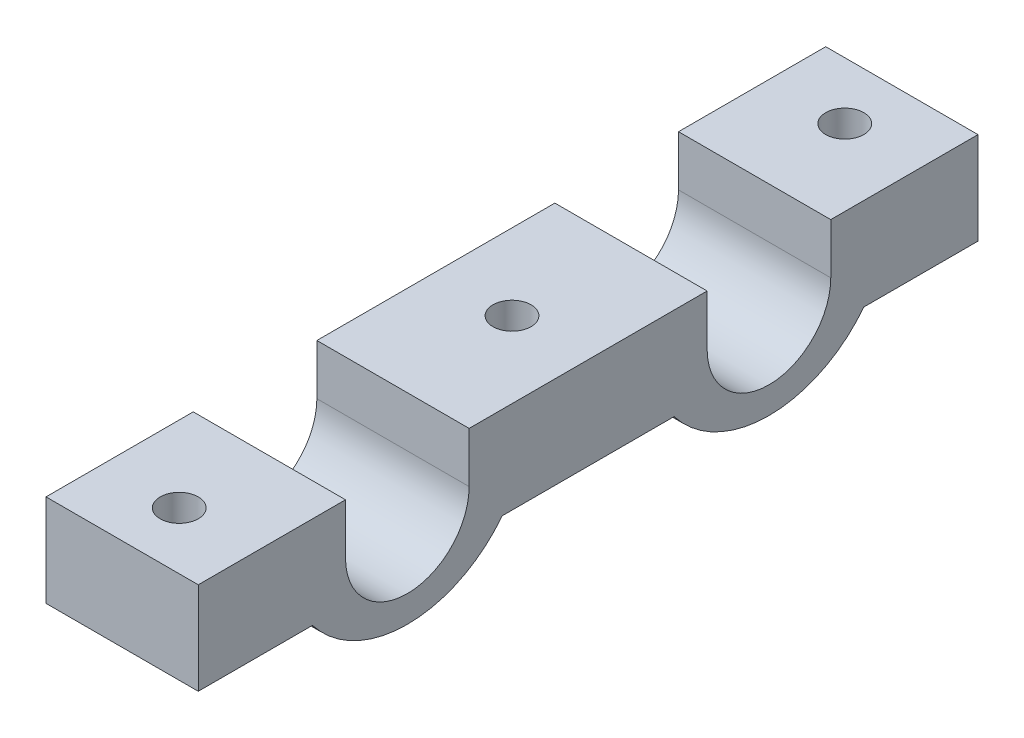
ISO-10303-21;
HEADER;
FILE_DESCRIPTION(('STEP AP214'),'2;1');
FILE_NAME('part.step','',(''),(''),'','','');
FILE_SCHEMA(('AUTOMOTIVE_DESIGN { 1 0 10303 214 1 1 1 1 }'));
ENDSEC;
DATA;
#1=APPLICATION_CONTEXT('core data for automotive mechanical design processes');
#2=APPLICATION_PROTOCOL_DEFINITION('international standard','automotive_design',2000,#1);
#3=PRODUCT_CONTEXT('',#1,'mechanical');
#4=PRODUCT('Part','Part','',(#3));
#5=PRODUCT_RELATED_PRODUCT_CATEGORY('part','',(#4));
#6=PRODUCT_DEFINITION_FORMATION('','',#4);
#7=PRODUCT_DEFINITION_CONTEXT('part definition',#1,'design');
#8=PRODUCT_DEFINITION('design','',#6,#7);
#9=PRODUCT_DEFINITION_SHAPE('','',#8);
#10=(LENGTH_UNIT() NAMED_UNIT(*) SI_UNIT(.MILLI.,.METRE.));
#11=(NAMED_UNIT(*) PLANE_ANGLE_UNIT() SI_UNIT($,.RADIAN.));
#12=(NAMED_UNIT(*) SI_UNIT($,.STERADIAN.) SOLID_ANGLE_UNIT());
#13=UNCERTAINTY_MEASURE_WITH_UNIT(LENGTH_MEASURE(1.E-05),#10,'distance_accuracy_value','');
#14=(GEOMETRIC_REPRESENTATION_CONTEXT(3) GLOBAL_UNCERTAINTY_ASSIGNED_CONTEXT((#13)) GLOBAL_UNIT_ASSIGNED_CONTEXT((#10,
#11,#12)) REPRESENTATION_CONTEXT('',''));
#15=CARTESIAN_POINT('',(0.,0.,0.));
#16=DIRECTION('',(0.,0.,1.));
#17=DIRECTION('',(1.,0.,0.));
#18=AXIS2_PLACEMENT_3D('',#15,#16,#17);
#19=CARTESIAN_POINT('',(40.,0.,0.));
#20=DIRECTION('',(-1.,0.,0.));
#21=DIRECTION('',(0.,0.,1.));
#22=AXIS2_PLACEMENT_3D('',#19,#20,#21);
#23=CYLINDRICAL_SURFACE('',#22,16.24);
#24=CARTESIAN_POINT('',(0.,0.,0.));
#25=DIRECTION('',(-1.,0.,0.));
#26=DIRECTION('',(0.,0.,-1.));
#27=AXIS2_PLACEMENT_3D('',#24,#25,#26);
#28=CIRCLE('',#27,16.24);
#29=CARTESIAN_POINT('',(0.,0.,-16.24));
#30=VERTEX_POINT('',#29);
#31=CARTESIAN_POINT('',(0.,0.,16.24));
#32=VERTEX_POINT('',#31);
#33=EDGE_CURVE('E194',#30,#32,#28,.T.);
#34=ORIENTED_EDGE('',*,*,#33,.T.);
#35=DIRECTION('',(-1.,0.,0.));
#36=VECTOR('',#35,1.);
#37=CARTESIAN_POINT('',(40.,0.,16.24));
#38=LINE('',#37,#36);
#39=CARTESIAN_POINT('',(40.,0.,16.24));
#40=VERTEX_POINT('',#39);
#41=EDGE_CURVE('E11',#40,#32,#38,.T.);
#42=ORIENTED_EDGE('',*,*,#41,.F.);
#43=CARTESIAN_POINT('',(40.,0.,0.));
#44=DIRECTION('',(-1.,0.,0.));
#45=DIRECTION('',(0.,0.,-1.));
#46=AXIS2_PLACEMENT_3D('',#43,#44,#45);
#47=CIRCLE('',#46,16.24);
#48=CARTESIAN_POINT('',(40.,0.,-16.24));
#49=VERTEX_POINT('',#48);
#50=EDGE_CURVE('E243',#49,#40,#47,.T.);
#51=ORIENTED_EDGE('',*,*,#50,.F.);
#52=DIRECTION('',(-1.,0.,0.));
#53=VECTOR('',#52,1.);
#54=CARTESIAN_POINT('',(40.,0.,-16.24));
#55=LINE('',#54,#53);
#56=EDGE_CURVE('E190',#49,#30,#55,.T.);
#57=ORIENTED_EDGE('',*,*,#56,.T.);
#58=EDGE_LOOP('',(#34,#42,#51,#57));
#59=FACE_BOUND('',#58,.T.);
#60=ADVANCED_FACE('F45',(#59),#23,.F.);
#61=CARTESIAN_POINT('',(40.,13.24,16.24));
#62=DIRECTION('',(0.,0.,1.));
#63=DIRECTION('',(1.,0.,0.));
#64=AXIS2_PLACEMENT_3D('',#61,#62,#63);
#65=PLANE('',#64);
#66=DIRECTION('',(0.,1.,0.));
#67=VECTOR('',#66,1.);
#68=CARTESIAN_POINT('',(0.,13.24,16.24));
#69=LINE('',#68,#67);
#70=CARTESIAN_POINT('',(0.,13.24,16.24));
#71=VERTEX_POINT('',#70);
#72=EDGE_CURVE('E198',#32,#71,#69,.T.);
#73=ORIENTED_EDGE('',*,*,#72,.T.);
#74=DIRECTION('',(-1.,0.,0.));
#75=VECTOR('',#74,1.);
#76=CARTESIAN_POINT('',(40.,13.24,16.24));
#77=LINE('',#76,#75);
#78=CARTESIAN_POINT('',(40.,13.24,16.24));
#79=VERTEX_POINT('',#78);
#80=EDGE_CURVE('E54',#79,#71,#77,.T.);
#81=ORIENTED_EDGE('',*,*,#80,.F.);
#82=DIRECTION('',(0.,1.,0.));
#83=VECTOR('',#82,1.);
#84=CARTESIAN_POINT('',(40.,13.24,16.24));
#85=LINE('',#84,#83);
#86=EDGE_CURVE('E129',#40,#79,#85,.T.);
#87=ORIENTED_EDGE('',*,*,#86,.F.);
#88=ORIENTED_EDGE('',*,*,#41,.T.);
#89=EDGE_LOOP('',(#73,#81,#87,#88));
#90=FACE_BOUND('',#89,.T.);
#91=ADVANCED_FACE('F365',(#90),#65,.F.);
#92=CARTESIAN_POINT('',(40.,13.24,54.9202247180879));
#93=DIRECTION('',(0.,-1.,0.));
#94=DIRECTION('',(0.,0.,-1.));
#95=AXIS2_PLACEMENT_3D('',#92,#93,#94);
#96=PLANE('',#95);
#97=CARTESIAN_POINT('',(20.,13.24,39.9202247180879));
#98=DIRECTION('',(0.,1.,0.));
#99=DIRECTION('',(0.,0.,1.));
#100=AXIS2_PLACEMENT_3D('',#97,#98,#99);
#101=CIRCLE('',#100,5.);
#102=CARTESIAN_POINT('',(20.,13.24,44.9202247180879));
#103=VERTEX_POINT('',#102);
#104=EDGE_CURVE('E635',#103,#103,#101,.T.);
#105=ORIENTED_EDGE('',*,*,#104,.F.);
#106=EDGE_LOOP('',(#105));
#107=FACE_BOUND('',#106,.T.);
#108=DIRECTION('',(0.,0.,1.));
#109=VECTOR('',#108,1.);
#110=CARTESIAN_POINT('',(0.,13.24,54.9202247180879));
#111=LINE('',#110,#109);
#112=CARTESIAN_POINT('',(0.,13.24,54.9202247180879));
#113=VERTEX_POINT('',#112);
#114=EDGE_CURVE('E202',#71,#113,#111,.T.);
#115=ORIENTED_EDGE('',*,*,#114,.T.);
#116=DIRECTION('',(-1.,0.,0.));
#117=VECTOR('',#116,1.);
#118=CARTESIAN_POINT('',(40.,13.24,54.9202247180879));
#119=LINE('',#118,#117);
#120=CARTESIAN_POINT('',(40.,13.24,54.9202247180879));
#121=VERTEX_POINT('',#120);
#122=EDGE_CURVE('E286',#121,#113,#119,.T.);
#123=ORIENTED_EDGE('',*,*,#122,.F.);
#124=DIRECTION('',(0.,0.,1.));
#125=VECTOR('',#124,1.);
#126=CARTESIAN_POINT('',(40.,13.24,54.9202247180879));
#127=LINE('',#126,#125);
#128=EDGE_CURVE('E296',#79,#121,#127,.T.);
#129=ORIENTED_EDGE('',*,*,#128,.F.);
#130=ORIENTED_EDGE('',*,*,#80,.T.);
#131=EDGE_LOOP('',(#115,#123,#129,#130));
#132=FACE_BOUND('',#131,.T.);
#133=ADVANCED_FACE('F294',(#107,#132),#96,.F.);
#134=CARTESIAN_POINT('',(40.,0.,54.9202247180879));
#135=DIRECTION('',(0.,0.,-1.));
#136=DIRECTION('',(-1.,0.,0.));
#137=AXIS2_PLACEMENT_3D('',#134,#135,#136);
#138=PLANE('',#137);
#139=DIRECTION('',(0.,-1.,0.));
#140=VECTOR('',#139,1.);
#141=CARTESIAN_POINT('',(0.,0.,54.9202247180879));
#142=LINE('',#141,#140);
#143=CARTESIAN_POINT('',(0.,-11.,54.9202247180879));
#144=VERTEX_POINT('',#143);
#145=EDGE_CURVE('E206',#113,#144,#142,.T.);
#146=ORIENTED_EDGE('',*,*,#145,.T.);
#147=DIRECTION('',(-1.,0.,0.));
#148=VECTOR('',#147,1.);
#149=CARTESIAN_POINT('',(40.,-11.,54.9202247180879));
#150=LINE('',#149,#148);
#151=CARTESIAN_POINT('',(40.,-11.,54.9202247180879));
#152=VERTEX_POINT('',#151);
#153=EDGE_CURVE('E282',#152,#144,#150,.T.);
#154=ORIENTED_EDGE('',*,*,#153,.F.);
#155=DIRECTION('',(0.,-1.,0.));
#156=VECTOR('',#155,1.);
#157=CARTESIAN_POINT('',(40.,0.,54.9202247180879));
#158=LINE('',#157,#156);
#159=EDGE_CURVE('E314',#121,#152,#158,.T.);
#160=ORIENTED_EDGE('',*,*,#159,.F.);
#161=ORIENTED_EDGE('',*,*,#122,.T.);
#162=EDGE_LOOP('',(#146,#154,#160,#161));
#163=FACE_BOUND('',#162,.T.);
#164=ADVANCED_FACE('F304',(#163),#138,.F.);
#165=CARTESIAN_POINT('',(40.,-11.,24.9202247180879));
#166=DIRECTION('',(0.,1.,0.));
#167=DIRECTION('',(0.,0.,1.));
#168=AXIS2_PLACEMENT_3D('',#165,#166,#167);
#169=PLANE('',#168);
#170=CARTESIAN_POINT('',(20.,-11.,39.9202247180879));
#171=DIRECTION('',(0.,1.,0.));
#172=DIRECTION('',(0.,0.,1.));
#173=AXIS2_PLACEMENT_3D('',#170,#171,#172);
#174=CIRCLE('',#173,5.);
#175=CARTESIAN_POINT('',(20.,-11.,44.9202247180879));
#176=VERTEX_POINT('',#175);
#177=EDGE_CURVE('E199',#176,#176,#174,.F.);
#178=ORIENTED_EDGE('',*,*,#177,.F.);
#179=EDGE_LOOP('',(#178));
#180=FACE_BOUND('',#179,.T.);
#181=DIRECTION('',(0.,0.,-1.));
#182=VECTOR('',#181,1.);
#183=CARTESIAN_POINT('',(0.,-11.,24.9202247180879));
#184=LINE('',#183,#182);
#185=CARTESIAN_POINT('',(0.,-11.,24.9202247180879));
#186=VERTEX_POINT('',#185);
#187=EDGE_CURVE('E209',#144,#186,#184,.T.);
#188=ORIENTED_EDGE('',*,*,#187,.T.);
#189=DIRECTION('',(-1.,0.,0.));
#190=VECTOR('',#189,1.);
#191=CARTESIAN_POINT('',(40.,-11.,24.9202247180879));
#192=LINE('',#191,#190);
#193=CARTESIAN_POINT('',(40.,-11.,24.9202247180879));
#194=VERTEX_POINT('',#193);
#195=EDGE_CURVE('E278',#194,#186,#192,.T.);
#196=ORIENTED_EDGE('',*,*,#195,.F.);
#197=DIRECTION('',(0.,0.,-1.));
#198=VECTOR('',#197,1.);
#199=CARTESIAN_POINT('',(40.,-11.,24.9202247180879));
#200=LINE('',#199,#198);
#201=EDGE_CURVE('E310',#152,#194,#200,.T.);
#202=ORIENTED_EDGE('',*,*,#201,.F.);
#203=ORIENTED_EDGE('',*,*,#153,.T.);
#204=EDGE_LOOP('',(#188,#196,#202,#203));
#205=FACE_BOUND('',#204,.T.);
#206=ADVANCED_FACE('F308',(#180,#205),#169,.F.);
#207=CARTESIAN_POINT('',(40.,8.2483660130719,0.));
#208=DIRECTION('',(-1.,0.,0.));
#209=DIRECTION('',(0.,0.,1.));
#210=AXIS2_PLACEMENT_3D('',#207,#208,#209);
#211=CYLINDRICAL_SURFACE('',#210,31.4883660130719);
#212=CARTESIAN_POINT('',(0.,8.2483660130719,0.));
#213=DIRECTION('',(1.,0.,0.));
#214=DIRECTION('',(0.,0.,-1.));
#215=AXIS2_PLACEMENT_3D('',#212,#213,#214);
#216=CIRCLE('',#215,31.4883660130719);
#217=CARTESIAN_POINT('',(0.,-11.,-24.9202247180879));
#218=VERTEX_POINT('',#217);
#219=EDGE_CURVE('E212',#186,#218,#216,.T.);
#220=ORIENTED_EDGE('',*,*,#219,.T.);
#221=DIRECTION('',(-1.,0.,0.));
#222=VECTOR('',#221,1.);
#223=CARTESIAN_POINT('',(40.,-11.,-24.9202247180879));
#224=LINE('',#223,#222);
#225=CARTESIAN_POINT('',(40.,-11.,-24.9202247180879));
#226=VERTEX_POINT('',#225);
#227=EDGE_CURVE('E274',#226,#218,#224,.T.);
#228=ORIENTED_EDGE('',*,*,#227,.F.);
#229=CARTESIAN_POINT('',(40.,8.2483660130719,0.));
#230=DIRECTION('',(1.,0.,0.));
#231=DIRECTION('',(0.,0.,-1.));
#232=AXIS2_PLACEMENT_3D('',#229,#230,#231);
#233=CIRCLE('',#232,31.4883660130719);
#234=EDGE_CURVE('E313',#194,#226,#233,.T.);
#235=ORIENTED_EDGE('',*,*,#234,.F.);
#236=ORIENTED_EDGE('',*,*,#195,.T.);
#237=EDGE_LOOP('',(#220,#228,#235,#236));
#238=FACE_BOUND('',#237,.T.);
#239=ADVANCED_FACE('F379',(#238),#211,.T.);
#240=CARTESIAN_POINT('',(40.,-11.,-24.9202247180879));
#241=DIRECTION('',(0.,1.,0.));
#242=DIRECTION('',(0.,0.,1.));
#243=AXIS2_PLACEMENT_3D('',#240,#241,#242);
#244=PLANE('',#243);
#245=CARTESIAN_POINT('',(20.,-11.,-47.5));
#246=DIRECTION('',(0.,1.,0.));
#247=DIRECTION('',(0.,0.,1.));
#248=AXIS2_PLACEMENT_3D('',#245,#246,#247);
#249=CIRCLE('',#248,5.);
#250=CARTESIAN_POINT('',(20.,-11.,-42.5));
#251=VERTEX_POINT('',#250);
#252=EDGE_CURVE('E644',#251,#251,#249,.F.);
#253=ORIENTED_EDGE('',*,*,#252,.F.);
#254=EDGE_LOOP('',(#253));
#255=FACE_BOUND('',#254,.T.);
#256=DIRECTION('',(0.,0.,-1.));
#257=VECTOR('',#256,1.);
#258=CARTESIAN_POINT('',(0.,-11.,-24.9202247180879));
#259=LINE('',#258,#257);
#260=CARTESIAN_POINT('',(0.,-11.,-70.0797752819121));
#261=VERTEX_POINT('',#260);
#262=EDGE_CURVE('E215',#218,#261,#259,.T.);
#263=ORIENTED_EDGE('',*,*,#262,.T.);
#264=DIRECTION('',(-1.,0.,0.));
#265=VECTOR('',#264,1.);
#266=CARTESIAN_POINT('',(40.,-11.,-70.0797752819121));
#267=LINE('',#266,#265);
#268=CARTESIAN_POINT('',(40.,-11.,-70.0797752819121));
#269=VERTEX_POINT('',#268);
#270=EDGE_CURVE('E270',#269,#261,#267,.T.);
#271=ORIENTED_EDGE('',*,*,#270,.F.);
#272=DIRECTION('',(0.,0.,-1.));
#273=VECTOR('',#272,1.);
#274=CARTESIAN_POINT('',(40.,-11.,-24.9202247180879));
#275=LINE('',#274,#273);
#276=EDGE_CURVE('E318',#226,#269,#275,.T.);
#277=ORIENTED_EDGE('',*,*,#276,.F.);
#278=ORIENTED_EDGE('',*,*,#227,.T.);
#279=EDGE_LOOP('',(#263,#271,#277,#278));
#280=FACE_BOUND('',#279,.T.);
#281=ADVANCED_FACE('F383',(#255,#280),#244,.F.);
#282=CARTESIAN_POINT('',(40.,8.2483660130719,-95.));
#283=DIRECTION('',(-1.,0.,0.));
#284=DIRECTION('',(0.,0.,1.));
#285=AXIS2_PLACEMENT_3D('',#282,#283,#284);
#286=CYLINDRICAL_SURFACE('',#285,31.4883660130719);
#287=CARTESIAN_POINT('',(0.,8.2483660130719,-95.));
#288=DIRECTION('',(1.,0.,0.));
#289=DIRECTION('',(0.,0.,-1.));
#290=AXIS2_PLACEMENT_3D('',#287,#288,#289);
#291=CIRCLE('',#290,31.4883660130719);
#292=CARTESIAN_POINT('',(0.,-11.,-119.920224718088));
#293=VERTEX_POINT('',#292);
#294=EDGE_CURVE('E218',#261,#293,#291,.T.);
#295=ORIENTED_EDGE('',*,*,#294,.T.);
#296=DIRECTION('',(-1.,0.,0.));
#297=VECTOR('',#296,1.);
#298=CARTESIAN_POINT('',(40.,-11.,-119.920224718088));
#299=LINE('',#298,#297);
#300=CARTESIAN_POINT('',(40.,-11.,-119.920224718088));
#301=VERTEX_POINT('',#300);
#302=EDGE_CURVE('E266',#301,#293,#299,.T.);
#303=ORIENTED_EDGE('',*,*,#302,.F.);
#304=CARTESIAN_POINT('',(40.,8.2483660130719,-95.));
#305=DIRECTION('',(1.,0.,0.));
#306=DIRECTION('',(0.,0.,-1.));
#307=AXIS2_PLACEMENT_3D('',#304,#305,#306);
#308=CIRCLE('',#307,31.4883660130719);
#309=EDGE_CURVE('E325',#269,#301,#308,.T.);
#310=ORIENTED_EDGE('',*,*,#309,.F.);
#311=ORIENTED_EDGE('',*,*,#270,.T.);
#312=EDGE_LOOP('',(#295,#303,#310,#311));
#313=FACE_BOUND('',#312,.T.);
#314=ADVANCED_FACE('F387',(#313),#286,.T.);
#315=CARTESIAN_POINT('',(40.,-11.,-119.920224718088));
#316=DIRECTION('',(0.,1.,0.));
#317=DIRECTION('',(0.,0.,1.));
#318=AXIS2_PLACEMENT_3D('',#315,#316,#317);
#319=PLANE('',#318);
#320=CARTESIAN_POINT('',(20.,-11.,-134.920224718088));
#321=DIRECTION('',(0.,1.,0.));
#322=DIRECTION('',(0.,0.,1.));
#323=AXIS2_PLACEMENT_3D('',#320,#321,#322);
#324=CIRCLE('',#323,5.);
#325=CARTESIAN_POINT('',(20.,-11.,-129.920224718088));
#326=VERTEX_POINT('',#325);
#327=EDGE_CURVE('E652',#326,#326,#324,.F.);
#328=ORIENTED_EDGE('',*,*,#327,.F.);
#329=EDGE_LOOP('',(#328));
#330=FACE_BOUND('',#329,.T.);
#331=DIRECTION('',(0.,0.,-1.));
#332=VECTOR('',#331,1.);
#333=CARTESIAN_POINT('',(0.,-11.,-119.920224718088));
#334=LINE('',#333,#332);
#335=CARTESIAN_POINT('',(0.,-11.,-149.920224718088));
#336=VERTEX_POINT('',#335);
#337=EDGE_CURVE('E221',#293,#336,#334,.T.);
#338=ORIENTED_EDGE('',*,*,#337,.T.);
#339=DIRECTION('',(-1.,0.,0.));
#340=VECTOR('',#339,1.);
#341=CARTESIAN_POINT('',(40.,-11.,-149.920224718088));
#342=LINE('',#341,#340);
#343=CARTESIAN_POINT('',(40.,-11.,-149.920224718088));
#344=VERTEX_POINT('',#343);
#345=EDGE_CURVE('E262',#344,#336,#342,.T.);
#346=ORIENTED_EDGE('',*,*,#345,.F.);
#347=DIRECTION('',(0.,0.,-1.));
#348=VECTOR('',#347,1.);
#349=CARTESIAN_POINT('',(40.,-11.,-119.920224718088));
#350=LINE('',#349,#348);
#351=EDGE_CURVE('E328',#301,#344,#350,.T.);
#352=ORIENTED_EDGE('',*,*,#351,.F.);
#353=ORIENTED_EDGE('',*,*,#302,.T.);
#354=EDGE_LOOP('',(#338,#346,#352,#353));
#355=FACE_BOUND('',#354,.T.);
#356=ADVANCED_FACE('F391',(#330,#355),#319,.F.);
#357=CARTESIAN_POINT('',(40.,13.24,-149.920224718088));
#358=DIRECTION('',(0.,0.,1.));
#359=DIRECTION('',(1.,0.,0.));
#360=AXIS2_PLACEMENT_3D('',#357,#358,#359);
#361=PLANE('',#360);
#362=DIRECTION('',(0.,1.,0.));
#363=VECTOR('',#362,1.);
#364=CARTESIAN_POINT('',(0.,13.24,-149.920224718088));
#365=LINE('',#364,#363);
#366=CARTESIAN_POINT('',(0.,13.24,-149.920224718088));
#367=VERTEX_POINT('',#366);
#368=EDGE_CURVE('E225',#336,#367,#365,.T.);
#369=ORIENTED_EDGE('',*,*,#368,.T.);
#370=DIRECTION('',(-1.,0.,0.));
#371=VECTOR('',#370,1.);
#372=CARTESIAN_POINT('',(40.,13.24,-149.920224718088));
#373=LINE('',#372,#371);
#374=CARTESIAN_POINT('',(40.,13.24,-149.920224718088));
#375=VERTEX_POINT('',#374);
#376=EDGE_CURVE('E258',#375,#367,#373,.T.);
#377=ORIENTED_EDGE('',*,*,#376,.F.);
#378=DIRECTION('',(0.,1.,0.));
#379=VECTOR('',#378,1.);
#380=CARTESIAN_POINT('',(40.,0.,-149.920224718088));
#381=LINE('',#380,#379);
#382=EDGE_CURVE('E331',#344,#375,#381,.T.);
#383=ORIENTED_EDGE('',*,*,#382,.F.);
#384=ORIENTED_EDGE('',*,*,#345,.T.);
#385=EDGE_LOOP('',(#369,#377,#383,#384));
#386=FACE_BOUND('',#385,.T.);
#387=ADVANCED_FACE('F395',(#386),#361,.F.);
#388=CARTESIAN_POINT('',(40.,13.24,-111.24));
#389=DIRECTION('',(0.,-1.,0.));
#390=DIRECTION('',(0.,0.,-1.));
#391=AXIS2_PLACEMENT_3D('',#388,#389,#390);
#392=PLANE('',#391);
#393=CARTESIAN_POINT('',(20.,13.24,-134.920224718088));
#394=DIRECTION('',(0.,1.,0.));
#395=DIRECTION('',(0.,0.,-1.));
#396=AXIS2_PLACEMENT_3D('',#393,#394,#395);
#397=CIRCLE('',#396,5.);
#398=CARTESIAN_POINT('',(20.,13.24,-139.920224718088));
#399=VERTEX_POINT('',#398);
#400=EDGE_CURVE('E648',#399,#399,#397,.T.);
#401=ORIENTED_EDGE('',*,*,#400,.F.);
#402=EDGE_LOOP('',(#401));
#403=FACE_BOUND('',#402,.T.);
#404=DIRECTION('',(0.,0.,1.));
#405=VECTOR('',#404,1.);
#406=CARTESIAN_POINT('',(0.,13.24,-111.24));
#407=LINE('',#406,#405);
#408=CARTESIAN_POINT('',(0.,13.24,-111.24));
#409=VERTEX_POINT('',#408);
#410=EDGE_CURVE('E228',#367,#409,#407,.T.);
#411=ORIENTED_EDGE('',*,*,#410,.T.);
#412=DIRECTION('',(-1.,0.,0.));
#413=VECTOR('',#412,1.);
#414=CARTESIAN_POINT('',(40.,13.24,-111.24));
#415=LINE('',#414,#413);
#416=CARTESIAN_POINT('',(40.,13.24,-111.24));
#417=VERTEX_POINT('',#416);
#418=EDGE_CURVE('E254',#417,#409,#415,.T.);
#419=ORIENTED_EDGE('',*,*,#418,.F.);
#420=DIRECTION('',(0.,0.,1.));
#421=VECTOR('',#420,1.);
#422=CARTESIAN_POINT('',(40.,13.24,-111.24));
#423=LINE('',#422,#421);
#424=EDGE_CURVE('E334',#375,#417,#423,.T.);
#425=ORIENTED_EDGE('',*,*,#424,.F.);
#426=ORIENTED_EDGE('',*,*,#376,.T.);
#427=EDGE_LOOP('',(#411,#419,#425,#426));
#428=FACE_BOUND('',#427,.T.);
#429=ADVANCED_FACE('F399',(#403,#428),#392,.F.);
#430=CARTESIAN_POINT('',(40.,0.,-111.24));
#431=DIRECTION('',(0.,0.,-1.));
#432=DIRECTION('',(-1.,0.,0.));
#433=AXIS2_PLACEMENT_3D('',#430,#431,#432);
#434=PLANE('',#433);
#435=DIRECTION('',(0.,-1.,0.));
#436=VECTOR('',#435,1.);
#437=CARTESIAN_POINT('',(0.,0.,-111.24));
#438=LINE('',#437,#436);
#439=CARTESIAN_POINT('',(0.,0.,-111.24));
#440=VERTEX_POINT('',#439);
#441=EDGE_CURVE('E231',#409,#440,#438,.T.);
#442=ORIENTED_EDGE('',*,*,#441,.T.);
#443=DIRECTION('',(-1.,0.,0.));
#444=VECTOR('',#443,1.);
#445=CARTESIAN_POINT('',(40.,0.,-111.24));
#446=LINE('',#445,#444);
#447=CARTESIAN_POINT('',(40.,0.,-111.24));
#448=VERTEX_POINT('',#447);
#449=EDGE_CURVE('E250',#448,#440,#446,.T.);
#450=ORIENTED_EDGE('',*,*,#449,.F.);
#451=DIRECTION('',(0.,-1.,0.));
#452=VECTOR('',#451,1.);
#453=CARTESIAN_POINT('',(40.,0.,-111.24));
#454=LINE('',#453,#452);
#455=EDGE_CURVE('E337',#417,#448,#454,.T.);
#456=ORIENTED_EDGE('',*,*,#455,.F.);
#457=ORIENTED_EDGE('',*,*,#418,.T.);
#458=EDGE_LOOP('',(#442,#450,#456,#457));
#459=FACE_BOUND('',#458,.T.);
#460=ADVANCED_FACE('F345',(#459),#434,.F.);
#461=CARTESIAN_POINT('',(40.,0.,-95.));
#462=DIRECTION('',(-1.,0.,0.));
#463=DIRECTION('',(0.,0.,1.));
#464=AXIS2_PLACEMENT_3D('',#461,#462,#463);
#465=CYLINDRICAL_SURFACE('',#464,16.24);
#466=CARTESIAN_POINT('',(0.,0.,-95.));
#467=DIRECTION('',(-1.,0.,0.));
#468=DIRECTION('',(0.,0.,-1.));
#469=AXIS2_PLACEMENT_3D('',#466,#467,#468);
#470=CIRCLE('',#469,16.24);
#471=CARTESIAN_POINT('',(0.,0.,-78.76));
#472=VERTEX_POINT('',#471);
#473=EDGE_CURVE('E234',#440,#472,#470,.T.);
#474=ORIENTED_EDGE('',*,*,#473,.T.);
#475=DIRECTION('',(-1.,0.,0.));
#476=VECTOR('',#475,1.);
#477=CARTESIAN_POINT('',(40.,0.,-78.76));
#478=LINE('',#477,#476);
#479=CARTESIAN_POINT('',(40.,0.,-78.76));
#480=VERTEX_POINT('',#479);
#481=EDGE_CURVE('E183',#480,#472,#478,.T.);
#482=ORIENTED_EDGE('',*,*,#481,.F.);
#483=CARTESIAN_POINT('',(40.,0.,-95.));
#484=DIRECTION('',(-1.,0.,0.));
#485=DIRECTION('',(0.,0.,-1.));
#486=AXIS2_PLACEMENT_3D('',#483,#484,#485);
#487=CIRCLE('',#486,16.24);
#488=EDGE_CURVE('E172',#448,#480,#487,.T.);
#489=ORIENTED_EDGE('',*,*,#488,.F.);
#490=ORIENTED_EDGE('',*,*,#449,.T.);
#491=EDGE_LOOP('',(#474,#482,#489,#490));
#492=FACE_BOUND('',#491,.T.);
#493=ADVANCED_FACE('F349',(#492),#465,.F.);
#494=CARTESIAN_POINT('',(40.,13.24,-78.76));
#495=DIRECTION('',(0.,0.,1.));
#496=DIRECTION('',(1.,0.,0.));
#497=AXIS2_PLACEMENT_3D('',#494,#495,#496);
#498=PLANE('',#497);
#499=DIRECTION('',(0.,1.,0.));
#500=VECTOR('',#499,1.);
#501=CARTESIAN_POINT('',(0.,13.24,-78.76));
#502=LINE('',#501,#500);
#503=CARTESIAN_POINT('',(0.,13.24,-78.76));
#504=VERTEX_POINT('',#503);
#505=EDGE_CURVE('E181',#472,#504,#502,.T.);
#506=ORIENTED_EDGE('',*,*,#505,.T.);
#507=DIRECTION('',(-1.,0.,0.));
#508=VECTOR('',#507,1.);
#509=CARTESIAN_POINT('',(40.,13.24,-78.76));
#510=LINE('',#509,#508);
#511=CARTESIAN_POINT('',(40.,13.24,-78.76));
#512=VERTEX_POINT('',#511);
#513=EDGE_CURVE('E178',#512,#504,#510,.T.);
#514=ORIENTED_EDGE('',*,*,#513,.F.);
#515=DIRECTION('',(0.,1.,0.));
#516=VECTOR('',#515,1.);
#517=CARTESIAN_POINT('',(40.,13.24,-78.76));
#518=LINE('',#517,#516);
#519=EDGE_CURVE('E166',#480,#512,#518,.T.);
#520=ORIENTED_EDGE('',*,*,#519,.F.);
#521=ORIENTED_EDGE('',*,*,#481,.T.);
#522=EDGE_LOOP('',(#506,#514,#520,#521));
#523=FACE_BOUND('',#522,.T.);
#524=ADVANCED_FACE('F179',(#523),#498,.F.);
#525=CARTESIAN_POINT('',(40.,13.24,-16.24));
#526=DIRECTION('',(0.,-1.,0.));
#527=DIRECTION('',(0.,0.,-1.));
#528=AXIS2_PLACEMENT_3D('',#525,#526,#527);
#529=PLANE('',#528);
#530=CARTESIAN_POINT('',(20.,13.24,-47.5));
#531=DIRECTION('',(0.,1.,0.));
#532=DIRECTION('',(0.,0.,1.));
#533=AXIS2_PLACEMENT_3D('',#530,#531,#532);
#534=CIRCLE('',#533,5.);
#535=CARTESIAN_POINT('',(20.,13.24,-42.5));
#536=VERTEX_POINT('',#535);
#537=EDGE_CURVE('E641',#536,#536,#534,.T.);
#538=ORIENTED_EDGE('',*,*,#537,.F.);
#539=EDGE_LOOP('',(#538));
#540=FACE_BOUND('',#539,.T.);
#541=DIRECTION('',(0.,0.,1.));
#542=VECTOR('',#541,1.);
#543=CARTESIAN_POINT('',(0.,13.24,-16.24));
#544=LINE('',#543,#542);
#545=CARTESIAN_POINT('',(0.,13.24,-16.24));
#546=VERTEX_POINT('',#545);
#547=EDGE_CURVE('E115',#504,#546,#544,.T.);
#548=ORIENTED_EDGE('',*,*,#547,.T.);
#549=DIRECTION('',(-1.,0.,0.));
#550=VECTOR('',#549,1.);
#551=CARTESIAN_POINT('',(40.,13.24,-16.24));
#552=LINE('',#551,#550);
#553=CARTESIAN_POINT('',(40.,13.24,-16.24));
#554=VERTEX_POINT('',#553);
#555=EDGE_CURVE('E184',#554,#546,#552,.T.);
#556=ORIENTED_EDGE('',*,*,#555,.F.);
#557=DIRECTION('',(0.,0.,1.));
#558=VECTOR('',#557,1.);
#559=CARTESIAN_POINT('',(40.,13.24,-16.24));
#560=LINE('',#559,#558);
#561=EDGE_CURVE('E170',#512,#554,#560,.T.);
#562=ORIENTED_EDGE('',*,*,#561,.F.);
#563=ORIENTED_EDGE('',*,*,#513,.T.);
#564=EDGE_LOOP('',(#548,#556,#562,#563));
#565=FACE_BOUND('',#564,.T.);
#566=ADVANCED_FACE('F186',(#540,#565),#529,.F.);
#567=CARTESIAN_POINT('',(40.,0.,-16.24));
#568=DIRECTION('',(0.,0.,-1.));
#569=DIRECTION('',(-1.,0.,0.));
#570=AXIS2_PLACEMENT_3D('',#567,#568,#569);
#571=PLANE('',#570);
#572=DIRECTION('',(0.,-1.,0.));
#573=VECTOR('',#572,1.);
#574=CARTESIAN_POINT('',(0.,0.,-16.24));
#575=LINE('',#574,#573);
#576=EDGE_CURVE('E121',#546,#30,#575,.T.);
#577=ORIENTED_EDGE('',*,*,#576,.T.);
#578=ORIENTED_EDGE('',*,*,#56,.F.);
#579=DIRECTION('',(0.,-1.,0.));
#580=VECTOR('',#579,1.);
#581=CARTESIAN_POINT('',(40.,0.,-16.24));
#582=LINE('',#581,#580);
#583=EDGE_CURVE('E62',#554,#49,#582,.T.);
#584=ORIENTED_EDGE('',*,*,#583,.F.);
#585=ORIENTED_EDGE('',*,*,#555,.T.);
#586=EDGE_LOOP('',(#577,#578,#584,#585));
#587=FACE_BOUND('',#586,.T.);
#588=ADVANCED_FACE('F353',(#587),#571,.F.);
#589=CARTESIAN_POINT('',(40.,0.,0.));
#590=DIRECTION('',(1.,0.,0.));
#591=DIRECTION('',(0.,0.,-1.));
#592=AXIS2_PLACEMENT_3D('',#589,#590,#591);
#593=PLANE('',#592);
#594=ORIENTED_EDGE('',*,*,#50,.T.);
#595=ORIENTED_EDGE('',*,*,#86,.T.);
#596=ORIENTED_EDGE('',*,*,#128,.T.);
#597=ORIENTED_EDGE('',*,*,#159,.T.);
#598=ORIENTED_EDGE('',*,*,#201,.T.);
#599=ORIENTED_EDGE('',*,*,#234,.T.);
#600=ORIENTED_EDGE('',*,*,#276,.T.);
#601=ORIENTED_EDGE('',*,*,#309,.T.);
#602=ORIENTED_EDGE('',*,*,#351,.T.);
#603=ORIENTED_EDGE('',*,*,#382,.T.);
#604=ORIENTED_EDGE('',*,*,#424,.T.);
#605=ORIENTED_EDGE('',*,*,#455,.T.);
#606=ORIENTED_EDGE('',*,*,#488,.T.);
#607=ORIENTED_EDGE('',*,*,#519,.T.);
#608=ORIENTED_EDGE('',*,*,#561,.T.);
#609=ORIENTED_EDGE('',*,*,#583,.T.);
#610=EDGE_LOOP('',(#594,#595,#596,#597,#598,#599,#600,#601,#602,#603,#604,#605,#606,#607,#608,#609));
#611=FACE_BOUND('',#610,.T.);
#612=ADVANCED_FACE('F168',(#611),#593,.T.);
#613=CARTESIAN_POINT('',(0.,0.,0.));
#614=DIRECTION('',(1.,0.,0.));
#615=DIRECTION('',(0.,0.,-1.));
#616=AXIS2_PLACEMENT_3D('',#613,#614,#615);
#617=PLANE('',#616);
#618=ORIENTED_EDGE('',*,*,#33,.F.);
#619=ORIENTED_EDGE('',*,*,#576,.F.);
#620=ORIENTED_EDGE('',*,*,#547,.F.);
#621=ORIENTED_EDGE('',*,*,#505,.F.);
#622=ORIENTED_EDGE('',*,*,#473,.F.);
#623=ORIENTED_EDGE('',*,*,#441,.F.);
#624=ORIENTED_EDGE('',*,*,#410,.F.);
#625=ORIENTED_EDGE('',*,*,#368,.F.);
#626=ORIENTED_EDGE('',*,*,#337,.F.);
#627=ORIENTED_EDGE('',*,*,#294,.F.);
#628=ORIENTED_EDGE('',*,*,#262,.F.);
#629=ORIENTED_EDGE('',*,*,#219,.F.);
#630=ORIENTED_EDGE('',*,*,#187,.F.);
#631=ORIENTED_EDGE('',*,*,#145,.F.);
#632=ORIENTED_EDGE('',*,*,#114,.F.);
#633=ORIENTED_EDGE('',*,*,#72,.F.);
#634=EDGE_LOOP('',(#618,#619,#620,#621,#622,#623,#624,#625,#626,#627,#628,#629,#630,#631,#632,#633));
#635=FACE_BOUND('',#634,.T.);
#636=ADVANCED_FACE('F299',(#635),#617,.F.);
#637=CARTESIAN_POINT('',(20.,-23.241,-47.5));
#638=DIRECTION('',(0.,1.,0.));
#639=DIRECTION('',(0.,0.,1.));
#640=AXIS2_PLACEMENT_3D('',#637,#638,#639);
#641=CYLINDRICAL_SURFACE('',#640,5.);
#642=ORIENTED_EDGE('',*,*,#537,.T.);
#643=EDGE_LOOP('',(#642));
#644=FACE_BOUND('',#643,.T.);
#645=ORIENTED_EDGE('',*,*,#252,.T.);
#646=EDGE_LOOP('',(#645));
#647=FACE_BOUND('',#646,.T.);
#648=ADVANCED_FACE('F438',(#644,#647),#641,.F.);
#649=CARTESIAN_POINT('',(20.,-23.241,-134.920224718088));
#650=DIRECTION('',(0.,1.,0.));
#651=DIRECTION('',(0.,0.,1.));
#652=AXIS2_PLACEMENT_3D('',#649,#650,#651);
#653=CYLINDRICAL_SURFACE('',#652,5.);
#654=ORIENTED_EDGE('',*,*,#400,.T.);
#655=EDGE_LOOP('',(#654));
#656=FACE_BOUND('',#655,.T.);
#657=ORIENTED_EDGE('',*,*,#327,.T.);
#658=EDGE_LOOP('',(#657));
#659=FACE_BOUND('',#658,.T.);
#660=ADVANCED_FACE('F446',(#656,#659),#653,.F.);
#661=CARTESIAN_POINT('',(20.,-23.241,39.9202247180879));
#662=DIRECTION('',(0.,1.,0.));
#663=DIRECTION('',(0.,0.,1.));
#664=AXIS2_PLACEMENT_3D('',#661,#662,#663);
#665=CYLINDRICAL_SURFACE('',#664,5.);
#666=ORIENTED_EDGE('',*,*,#104,.T.);
#667=EDGE_LOOP('',(#666));
#668=FACE_BOUND('',#667,.T.);
#669=ORIENTED_EDGE('',*,*,#177,.T.);
#670=EDGE_LOOP('',(#669));
#671=FACE_BOUND('',#670,.T.);
#672=ADVANCED_FACE('F456',(#668,#671),#665,.F.);
#673=CLOSED_SHELL('',(#60,#91,#133,#164,#206,#239,#281,#314,#356,#387,#429,#460,#493,#524,#566,
#588,#612,#636,#648,#660,#672));
#674=MANIFOLD_SOLID_BREP('B2',#673);
#675=ADVANCED_BREP_SHAPE_REPRESENTATION('',(#18,#674),#14);
#676=SHAPE_DEFINITION_REPRESENTATION(#9,#675);
ENDSEC;
END-ISO-10303-21;
